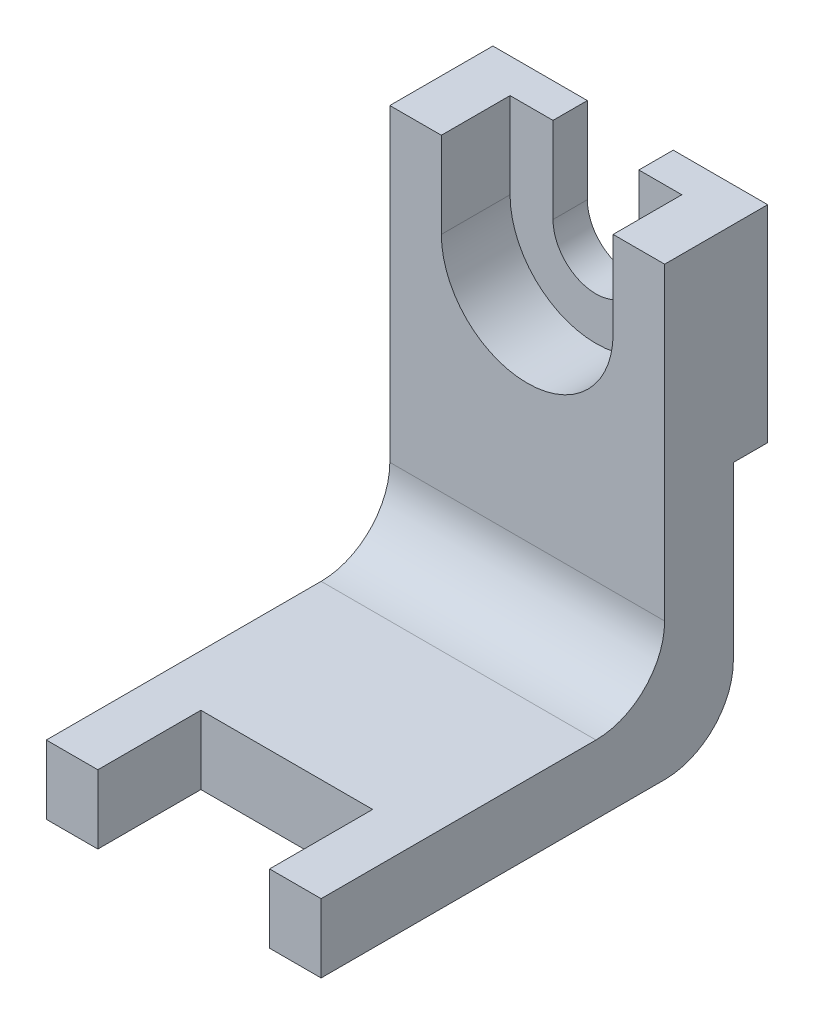
ISO-10303-21;
HEADER;
FILE_DESCRIPTION(('STEP AP214'),'2;1');
FILE_NAME('part.step','',(''),(''),'','','');
FILE_SCHEMA(('AUTOMOTIVE_DESIGN { 1 0 10303 214 1 1 1 1 }'));
ENDSEC;
DATA;
#1=APPLICATION_CONTEXT('core data for automotive mechanical design processes');
#2=APPLICATION_PROTOCOL_DEFINITION('international standard','automotive_design',2000,#1);
#3=PRODUCT_CONTEXT('',#1,'mechanical');
#4=PRODUCT('Part','Part','',(#3));
#5=PRODUCT_RELATED_PRODUCT_CATEGORY('part','',(#4));
#6=PRODUCT_DEFINITION_FORMATION('','',#4);
#7=PRODUCT_DEFINITION_CONTEXT('part definition',#1,'design');
#8=PRODUCT_DEFINITION('design','',#6,#7);
#9=PRODUCT_DEFINITION_SHAPE('','',#8);
#10=(LENGTH_UNIT() NAMED_UNIT(*) SI_UNIT(.MILLI.,.METRE.));
#11=(NAMED_UNIT(*) PLANE_ANGLE_UNIT() SI_UNIT($,.RADIAN.));
#12=(NAMED_UNIT(*) SI_UNIT($,.STERADIAN.) SOLID_ANGLE_UNIT());
#13=UNCERTAINTY_MEASURE_WITH_UNIT(LENGTH_MEASURE(1.E-05),#10,'distance_accuracy_value','');
#14=(GEOMETRIC_REPRESENTATION_CONTEXT(3) GLOBAL_UNCERTAINTY_ASSIGNED_CONTEXT((#13)) GLOBAL_UNIT_ASSIGNED_CONTEXT((#10,
#11,#12)) REPRESENTATION_CONTEXT('',''));
#15=CARTESIAN_POINT('',(0.,0.,0.));
#16=DIRECTION('',(0.,0.,1.));
#17=DIRECTION('',(1.,0.,0.));
#18=AXIS2_PLACEMENT_3D('',#15,#16,#17);
#19=CARTESIAN_POINT('',(-8.,13.,4.));
#20=DIRECTION('',(0.,-1.,0.));
#21=DIRECTION('',(0.,0.,-1.));
#22=AXIS2_PLACEMENT_3D('',#19,#20,#21);
#23=PLANE('',#22);
#24=DIRECTION('',(1.,0.,0.));
#25=VECTOR('',#24,1.);
#26=CARTESIAN_POINT('',(8.,13.,-2.));
#27=LINE('',#26,#25);
#28=CARTESIAN_POINT('',(2.5,13.,-2.));
#29=VERTEX_POINT('',#28);
#30=CARTESIAN_POINT('',(8.,13.,-2.));
#31=VERTEX_POINT('',#30);
#32=EDGE_CURVE('E251',#29,#31,#27,.T.);
#33=ORIENTED_EDGE('',*,*,#32,.F.);
#34=DIRECTION('',(0.,0.,1.));
#35=VECTOR('',#34,1.);
#36=CARTESIAN_POINT('',(2.5,13.,-2.));
#37=LINE('',#36,#35);
#38=CARTESIAN_POINT('',(2.5,13.,0.));
#39=VERTEX_POINT('',#38);
#40=EDGE_CURVE('E478',#29,#39,#37,.T.);
#41=ORIENTED_EDGE('',*,*,#40,.T.);
#42=DIRECTION('',(-1.,0.,0.));
#43=VECTOR('',#42,1.);
#44=CARTESIAN_POINT('',(-5.,13.,0.));
#45=LINE('',#44,#43);
#46=CARTESIAN_POINT('',(5.,13.,0.));
#47=VERTEX_POINT('',#46);
#48=EDGE_CURVE('E485',#47,#39,#45,.T.);
#49=ORIENTED_EDGE('',*,*,#48,.F.);
#50=DIRECTION('',(0.,0.,1.));
#51=VECTOR('',#50,1.);
#52=CARTESIAN_POINT('',(5.,13.,0.));
#53=LINE('',#52,#51);
#54=CARTESIAN_POINT('',(5.,13.,4.));
#55=VERTEX_POINT('',#54);
#56=EDGE_CURVE('E369',#47,#55,#53,.T.);
#57=ORIENTED_EDGE('',*,*,#56,.T.);
#58=DIRECTION('',(-1.,0.,0.));
#59=VECTOR('',#58,1.);
#60=CARTESIAN_POINT('',(-8.,13.,4.));
#61=LINE('',#60,#59);
#62=CARTESIAN_POINT('',(8.,13.,4.));
#63=VERTEX_POINT('',#62);
#64=EDGE_CURVE('E300',#63,#55,#61,.T.);
#65=ORIENTED_EDGE('',*,*,#64,.F.);
#66=DIRECTION('',(0.,0.,-1.));
#67=VECTOR('',#66,1.);
#68=CARTESIAN_POINT('',(8.,13.,4.));
#69=LINE('',#68,#67);
#70=EDGE_CURVE('E317',#63,#31,#69,.T.);
#71=ORIENTED_EDGE('',*,*,#70,.T.);
#72=EDGE_LOOP('',(#33,#41,#49,#57,#65,#71));
#73=FACE_BOUND('',#72,.T.);
#74=ADVANCED_FACE('F48',(#73),#23,.F.);
#75=CARTESIAN_POINT('',(0.,0.,24.));
#76=DIRECTION('',(0.,0.,-1.));
#77=DIRECTION('',(-1.,0.,0.));
#78=AXIS2_PLACEMENT_3D('',#75,#76,#77);
#79=PLANE('',#78);
#80=DIRECTION('',(-1.,0.,0.));
#81=VECTOR('',#80,1.);
#82=CARTESIAN_POINT('',(-8.,-8.99177735610371,24.));
#83=LINE('',#82,#81);
#84=CARTESIAN_POINT('',(8.,-8.99177735610371,24.));
#85=VERTEX_POINT('',#84);
#86=CARTESIAN_POINT('',(5.,-8.99177735610371,24.));
#87=VERTEX_POINT('',#86);
#88=EDGE_CURVE('E388',#85,#87,#83,.T.);
#89=ORIENTED_EDGE('',*,*,#88,.T.);
#90=DIRECTION('',(0.,1.,0.));
#91=VECTOR('',#90,1.);
#92=CARTESIAN_POINT('',(5.,-12.9917773561037,24.));
#93=LINE('',#92,#91);
#94=CARTESIAN_POINT('',(5.,-12.9917773561037,24.));
#95=VERTEX_POINT('',#94);
#96=EDGE_CURVE('E273',#95,#87,#93,.T.);
#97=ORIENTED_EDGE('',*,*,#96,.F.);
#98=DIRECTION('',(1.,0.,0.));
#99=VECTOR('',#98,1.);
#100=CARTESIAN_POINT('',(-8.,-12.9917773561037,24.));
#101=LINE('',#100,#99);
#102=CARTESIAN_POINT('',(8.,-12.9917773561037,24.));
#103=VERTEX_POINT('',#102);
#104=EDGE_CURVE('E408',#95,#103,#101,.T.);
#105=ORIENTED_EDGE('',*,*,#104,.T.);
#106=DIRECTION('',(0.,1.,0.));
#107=VECTOR('',#106,1.);
#108=CARTESIAN_POINT('',(8.,-12.9917773561037,24.));
#109=LINE('',#108,#107);
#110=EDGE_CURVE('E284',#103,#85,#109,.T.);
#111=ORIENTED_EDGE('',*,*,#110,.T.);
#112=EDGE_LOOP('',(#89,#97,#105,#111));
#113=FACE_BOUND('',#112,.T.);
#114=ADVANCED_FACE('F514',(#113),#79,.F.);
#115=CARTESIAN_POINT('',(0.,-8.99177735610371,4.));
#116=DIRECTION('',(1.,0.,0.));
#117=DIRECTION('',(0.,0.,-1.));
#118=AXIS2_PLACEMENT_3D('',#115,#116,#117);
#119=CYLINDRICAL_SURFACE('',#118,4.);
#120=DIRECTION('',(-1.,0.,0.));
#121=VECTOR('',#120,1.);
#122=CARTESIAN_POINT('',(0.,-8.99177735610371,0.));
#123=LINE('',#122,#121);
#124=CARTESIAN_POINT('',(8.,-8.99177735610371,0.));
#125=VERTEX_POINT('',#124);
#126=CARTESIAN_POINT('',(-8.,-8.99177735610372,0.));
#127=VERTEX_POINT('',#126);
#128=EDGE_CURVE('E335',#125,#127,#123,.T.);
#129=ORIENTED_EDGE('',*,*,#128,.F.);
#130=CARTESIAN_POINT('',(8.,-8.99177735610371,4.));
#131=DIRECTION('',(-1.,0.,0.));
#132=DIRECTION('',(0.,0.,1.));
#133=AXIS2_PLACEMENT_3D('',#130,#131,#132);
#134=CIRCLE('',#133,4.);
#135=CARTESIAN_POINT('',(8.,-12.9917773561037,4.));
#136=VERTEX_POINT('',#135);
#137=EDGE_CURVE('E57',#136,#125,#134,.F.);
#138=ORIENTED_EDGE('',*,*,#137,.F.);
#139=DIRECTION('',(1.,0.,0.));
#140=VECTOR('',#139,1.);
#141=CARTESIAN_POINT('',(-8.,-12.9917773561037,4.));
#142=LINE('',#141,#140);
#143=CARTESIAN_POINT('',(-8.,-12.9917773561037,4.));
#144=VERTEX_POINT('',#143);
#145=EDGE_CURVE('E283',#144,#136,#142,.T.);
#146=ORIENTED_EDGE('',*,*,#145,.F.);
#147=CARTESIAN_POINT('',(-8.,-8.99177735610371,4.));
#148=DIRECTION('',(1.,0.,0.));
#149=DIRECTION('',(0.,0.,-1.));
#150=AXIS2_PLACEMENT_3D('',#147,#148,#149);
#151=CIRCLE('',#150,4.);
#152=EDGE_CURVE('E12',#127,#144,#151,.F.);
#153=ORIENTED_EDGE('',*,*,#152,.F.);
#154=EDGE_LOOP('',(#129,#138,#146,#153));
#155=FACE_BOUND('',#154,.T.);
#156=ADVANCED_FACE('F50',(#155),#119,.T.);
#157=CARTESIAN_POINT('',(0.,-4.99177735610371,8.));
#158=DIRECTION('',(-1.,0.,0.));
#159=DIRECTION('',(0.,0.,1.));
#160=AXIS2_PLACEMENT_3D('',#157,#158,#159);
#161=CYLINDRICAL_SURFACE('',#160,4.);
#162=DIRECTION('',(1.,0.,0.));
#163=VECTOR('',#162,1.);
#164=CARTESIAN_POINT('',(0.,-4.99177735610371,4.));
#165=LINE('',#164,#163);
#166=CARTESIAN_POINT('',(-8.,-4.99177735610371,4.));
#167=VERTEX_POINT('',#166);
#168=CARTESIAN_POINT('',(8.,-4.99177735610371,4.));
#169=VERTEX_POINT('',#168);
#170=EDGE_CURVE('E321',#167,#169,#165,.T.);
#171=ORIENTED_EDGE('',*,*,#170,.F.);
#172=CARTESIAN_POINT('',(-8.,-4.99177735610371,8.));
#173=DIRECTION('',(1.,0.,0.));
#174=DIRECTION('',(0.,0.,-1.));
#175=AXIS2_PLACEMENT_3D('',#172,#173,#174);
#176=CIRCLE('',#175,4.);
#177=CARTESIAN_POINT('',(-8.,-8.99177735610371,8.));
#178=VERTEX_POINT('',#177);
#179=EDGE_CURVE('E329',#167,#178,#176,.F.);
#180=ORIENTED_EDGE('',*,*,#179,.T.);
#181=DIRECTION('',(1.,0.,0.));
#182=VECTOR('',#181,1.);
#183=CARTESIAN_POINT('',(0.,-8.99177735610371,8.));
#184=LINE('',#183,#182);
#185=CARTESIAN_POINT('',(8.,-8.99177735610371,8.));
#186=VERTEX_POINT('',#185);
#187=EDGE_CURVE('E325',#186,#178,#184,.F.);
#188=ORIENTED_EDGE('',*,*,#187,.F.);
#189=CARTESIAN_POINT('',(8.,-4.99177735610371,8.));
#190=DIRECTION('',(-1.,0.,0.));
#191=DIRECTION('',(0.,0.,1.));
#192=AXIS2_PLACEMENT_3D('',#189,#190,#191);
#193=CIRCLE('',#192,4.);
#194=EDGE_CURVE('E332',#186,#169,#193,.F.);
#195=ORIENTED_EDGE('',*,*,#194,.T.);
#196=EDGE_LOOP('',(#171,#180,#188,#195));
#197=FACE_BOUND('',#196,.T.);
#198=ADVANCED_FACE('F380',(#197),#161,.F.);
#199=CARTESIAN_POINT('',(0.,0.,4.));
#200=DIRECTION('',(0.,0.,-1.));
#201=DIRECTION('',(-1.,0.,0.));
#202=AXIS2_PLACEMENT_3D('',#199,#200,#201);
#203=PLANE('',#202);
#204=ORIENTED_EDGE('',*,*,#64,.T.);
#205=DIRECTION('',(0.,1.,0.));
#206=VECTOR('',#205,1.);
#207=CARTESIAN_POINT('',(5.,13.,4.));
#208=LINE('',#207,#206);
#209=CARTESIAN_POINT('',(5.,8.,4.));
#210=VERTEX_POINT('',#209);
#211=EDGE_CURVE('E374',#210,#55,#208,.T.);
#212=ORIENTED_EDGE('',*,*,#211,.F.);
#213=CARTESIAN_POINT('',(0.,8.,4.));
#214=DIRECTION('',(0.,0.,1.));
#215=DIRECTION('',(1.,0.,0.));
#216=AXIS2_PLACEMENT_3D('',#213,#214,#215);
#217=CIRCLE('',#216,5.);
#218=CARTESIAN_POINT('',(-5.,8.,4.));
#219=VERTEX_POINT('',#218);
#220=EDGE_CURVE('E477',#219,#210,#217,.T.);
#221=ORIENTED_EDGE('',*,*,#220,.F.);
#222=DIRECTION('',(0.,-1.,0.));
#223=VECTOR('',#222,1.);
#224=CARTESIAN_POINT('',(-5.,13.,4.));
#225=LINE('',#224,#223);
#226=CARTESIAN_POINT('',(-5.,13.,4.));
#227=VERTEX_POINT('',#226);
#228=EDGE_CURVE('E475',#227,#219,#225,.T.);
#229=ORIENTED_EDGE('',*,*,#228,.F.);
#230=CARTESIAN_POINT('',(-8.,13.,4.));
#231=VERTEX_POINT('',#230);
#232=EDGE_CURVE('E296',#227,#231,#61,.T.);
#233=ORIENTED_EDGE('',*,*,#232,.T.);
#234=DIRECTION('',(0.,-1.,0.));
#235=VECTOR('',#234,1.);
#236=CARTESIAN_POINT('',(-8.,-13.,4.));
#237=LINE('',#236,#235);
#238=EDGE_CURVE('E304',#231,#167,#237,.T.);
#239=ORIENTED_EDGE('',*,*,#238,.T.);
#240=ORIENTED_EDGE('',*,*,#170,.T.);
#241=DIRECTION('',(0.,1.,0.));
#242=VECTOR('',#241,1.);
#243=CARTESIAN_POINT('',(8.,-13.,4.));
#244=LINE('',#243,#242);
#245=EDGE_CURVE('E291',#169,#63,#244,.T.);
#246=ORIENTED_EDGE('',*,*,#245,.T.);
#247=EDGE_LOOP('',(#204,#212,#221,#229,#233,#239,#240,#246));
#248=FACE_BOUND('',#247,.T.);
#249=ADVANCED_FACE('F372',(#248),#203,.F.);
#250=CARTESIAN_POINT('',(8.,-13.,4.));
#251=DIRECTION('',(-1.,0.,0.));
#252=DIRECTION('',(0.,0.,1.));
#253=AXIS2_PLACEMENT_3D('',#250,#251,#252);
#254=PLANE('',#253);
#255=DIRECTION('',(0.,0.,-1.));
#256=VECTOR('',#255,1.);
#257=CARTESIAN_POINT('',(8.,-12.9917773561037,24.));
#258=LINE('',#257,#256);
#259=EDGE_CURVE('E348',#103,#136,#258,.T.);
#260=ORIENTED_EDGE('',*,*,#259,.T.);
#261=ORIENTED_EDGE('',*,*,#137,.T.);
#262=DIRECTION('',(0.,1.,0.));
#263=VECTOR('',#262,1.);
#264=CARTESIAN_POINT('',(8.,-13.,0.));
#265=LINE('',#264,#263);
#266=CARTESIAN_POINT('',(8.,1.,0.));
#267=VERTEX_POINT('',#266);
#268=EDGE_CURVE('E308',#125,#267,#265,.T.);
#269=ORIENTED_EDGE('',*,*,#268,.T.);
#270=DIRECTION('',(0.,0.,1.));
#271=VECTOR('',#270,1.);
#272=CARTESIAN_POINT('',(8.,1.,-2.));
#273=LINE('',#272,#271);
#274=CARTESIAN_POINT('',(8.,1.,-2.));
#275=VERTEX_POINT('',#274);
#276=EDGE_CURVE('E278',#275,#267,#273,.T.);
#277=ORIENTED_EDGE('',*,*,#276,.F.);
#278=DIRECTION('',(0.,-1.,0.));
#279=VECTOR('',#278,1.);
#280=CARTESIAN_POINT('',(8.,1.,-2.));
#281=LINE('',#280,#279);
#282=EDGE_CURVE('E250',#31,#275,#281,.T.);
#283=ORIENTED_EDGE('',*,*,#282,.F.);
#284=ORIENTED_EDGE('',*,*,#70,.F.);
#285=ORIENTED_EDGE('',*,*,#245,.F.);
#286=ORIENTED_EDGE('',*,*,#194,.F.);
#287=DIRECTION('',(0.,0.,-1.));
#288=VECTOR('',#287,1.);
#289=CARTESIAN_POINT('',(8.,-8.99177735610371,24.));
#290=LINE('',#289,#288);
#291=EDGE_CURVE('E298',#85,#186,#290,.T.);
#292=ORIENTED_EDGE('',*,*,#291,.F.);
#293=ORIENTED_EDGE('',*,*,#110,.F.);
#294=EDGE_LOOP('',(#260,#261,#269,#277,#283,#284,#285,#286,#292,#293));
#295=FACE_BOUND('',#294,.T.);
#296=ADVANCED_FACE('F342',(#295),#254,.F.);
#297=CARTESIAN_POINT('',(-2.5,13.,0.));
#298=VERTEX_POINT('',#297);
#299=CARTESIAN_POINT('',(-5.,13.,0.));
#300=VERTEX_POINT('',#299);
#301=EDGE_CURVE('E242',#298,#300,#45,.T.);
#302=ORIENTED_EDGE('',*,*,#301,.F.);
#303=DIRECTION('',(0.,0.,1.));
#304=VECTOR('',#303,1.);
#305=CARTESIAN_POINT('',(-2.5,13.,-2.));
#306=LINE('',#305,#304);
#307=CARTESIAN_POINT('',(-2.5,13.,-2.));
#308=VERTEX_POINT('',#307);
#309=EDGE_CURVE('E64',#308,#298,#306,.T.);
#310=ORIENTED_EDGE('',*,*,#309,.F.);
#311=CARTESIAN_POINT('',(-8.,13.,-2.));
#312=VERTEX_POINT('',#311);
#313=EDGE_CURVE('E239',#312,#308,#27,.T.);
#314=ORIENTED_EDGE('',*,*,#313,.F.);
#315=DIRECTION('',(0.,0.,-1.));
#316=VECTOR('',#315,1.);
#317=CARTESIAN_POINT('',(-8.,13.,4.));
#318=LINE('',#317,#316);
#319=EDGE_CURVE('E307',#231,#312,#318,.T.);
#320=ORIENTED_EDGE('',*,*,#319,.F.);
#321=ORIENTED_EDGE('',*,*,#232,.F.);
#322=DIRECTION('',(0.,0.,1.));
#323=VECTOR('',#322,1.);
#324=CARTESIAN_POINT('',(-5.,13.,0.));
#325=LINE('',#324,#323);
#326=EDGE_CURVE('E461',#300,#227,#325,.T.);
#327=ORIENTED_EDGE('',*,*,#326,.F.);
#328=EDGE_LOOP('',(#302,#310,#314,#320,#321,#327));
#329=FACE_BOUND('',#328,.T.);
#330=ADVANCED_FACE('F237',(#329),#23,.F.);
#331=CARTESIAN_POINT('',(-8.,-13.,4.));
#332=DIRECTION('',(1.,0.,0.));
#333=DIRECTION('',(0.,0.,-1.));
#334=AXIS2_PLACEMENT_3D('',#331,#332,#333);
#335=PLANE('',#334);
#336=DIRECTION('',(0.,-1.,0.));
#337=VECTOR('',#336,1.);
#338=CARTESIAN_POINT('',(-8.,-13.,0.));
#339=LINE('',#338,#337);
#340=CARTESIAN_POINT('',(-8.,1.,0.));
#341=VERTEX_POINT('',#340);
#342=EDGE_CURVE('E297',#341,#127,#339,.T.);
#343=ORIENTED_EDGE('',*,*,#342,.T.);
#344=ORIENTED_EDGE('',*,*,#152,.T.);
#345=DIRECTION('',(0.,0.,-1.));
#346=VECTOR('',#345,1.);
#347=CARTESIAN_POINT('',(-8.,-12.9917773561037,24.));
#348=LINE('',#347,#346);
#349=CARTESIAN_POINT('',(-8.,-12.9917773561037,24.));
#350=VERTEX_POINT('',#349);
#351=EDGE_CURVE('E393',#350,#144,#348,.T.);
#352=ORIENTED_EDGE('',*,*,#351,.F.);
#353=DIRECTION('',(0.,-1.,0.));
#354=VECTOR('',#353,1.);
#355=CARTESIAN_POINT('',(-8.,-12.9917773561037,24.));
#356=LINE('',#355,#354);
#357=CARTESIAN_POINT('',(-8.,-8.99177735610371,24.));
#358=VERTEX_POINT('',#357);
#359=EDGE_CURVE('E409',#358,#350,#356,.T.);
#360=ORIENTED_EDGE('',*,*,#359,.F.);
#361=DIRECTION('',(0.,0.,-1.));
#362=VECTOR('',#361,1.);
#363=CARTESIAN_POINT('',(-8.,-8.99177735610371,24.));
#364=LINE('',#363,#362);
#365=EDGE_CURVE('E391',#358,#178,#364,.T.);
#366=ORIENTED_EDGE('',*,*,#365,.T.);
#367=ORIENTED_EDGE('',*,*,#179,.F.);
#368=ORIENTED_EDGE('',*,*,#238,.F.);
#369=ORIENTED_EDGE('',*,*,#319,.T.);
#370=DIRECTION('',(0.,1.,0.));
#371=VECTOR('',#370,1.);
#372=CARTESIAN_POINT('',(-8.,1.,-2.));
#373=LINE('',#372,#371);
#374=CARTESIAN_POINT('',(-8.,1.,-2.));
#375=VERTEX_POINT('',#374);
#376=EDGE_CURVE('E248',#375,#312,#373,.T.);
#377=ORIENTED_EDGE('',*,*,#376,.F.);
#378=DIRECTION('',(0.,0.,1.));
#379=VECTOR('',#378,1.);
#380=CARTESIAN_POINT('',(-8.,1.,-2.));
#381=LINE('',#380,#379);
#382=EDGE_CURVE('E274',#375,#341,#381,.T.);
#383=ORIENTED_EDGE('',*,*,#382,.T.);
#384=EDGE_LOOP('',(#343,#344,#352,#360,#366,#367,#368,#369,#377,#383));
#385=FACE_BOUND('',#384,.T.);
#386=ADVANCED_FACE('F498',(#385),#335,.F.);
#387=CARTESIAN_POINT('',(0.,0.,0.));
#388=DIRECTION('',(0.,0.,-1.));
#389=DIRECTION('',(-1.,0.,0.));
#390=AXIS2_PLACEMENT_3D('',#387,#388,#389);
#391=PLANE('',#390);
#392=ORIENTED_EDGE('',*,*,#268,.F.);
#393=ORIENTED_EDGE('',*,*,#128,.T.);
#394=ORIENTED_EDGE('',*,*,#342,.F.);
#395=DIRECTION('',(-1.,0.,0.));
#396=VECTOR('',#395,1.);
#397=CARTESIAN_POINT('',(8.,1.,0.));
#398=LINE('',#397,#396);
#399=EDGE_CURVE('E268',#267,#341,#398,.T.);
#400=ORIENTED_EDGE('',*,*,#399,.F.);
#401=EDGE_LOOP('',(#392,#393,#394,#400));
#402=FACE_BOUND('',#401,.T.);
#403=ADVANCED_FACE('F353',(#402),#391,.T.);
#404=CARTESIAN_POINT('',(-8.,-8.99177735610371,24.));
#405=DIRECTION('',(0.,-1.,0.));
#406=DIRECTION('',(0.,0.,-1.));
#407=AXIS2_PLACEMENT_3D('',#404,#405,#406);
#408=PLANE('',#407);
#409=DIRECTION('',(-1.,0.,0.));
#410=VECTOR('',#409,1.);
#411=CARTESIAN_POINT('',(-5.,-8.99177735610371,18.));
#412=LINE('',#411,#410);
#413=CARTESIAN_POINT('',(5.,-8.99177735610371,18.));
#414=VERTEX_POINT('',#413);
#415=CARTESIAN_POINT('',(-5.,-8.99177735610371,18.));
#416=VERTEX_POINT('',#415);
#417=EDGE_CURVE('E424',#414,#416,#412,.T.);
#418=ORIENTED_EDGE('',*,*,#417,.F.);
#419=DIRECTION('',(0.,0.,-1.));
#420=VECTOR('',#419,1.);
#421=CARTESIAN_POINT('',(5.,-8.99177735610371,24.));
#422=LINE('',#421,#420);
#423=EDGE_CURVE('E445',#87,#414,#422,.T.);
#424=ORIENTED_EDGE('',*,*,#423,.F.);
#425=ORIENTED_EDGE('',*,*,#88,.F.);
#426=ORIENTED_EDGE('',*,*,#291,.T.);
#427=ORIENTED_EDGE('',*,*,#187,.T.);
#428=ORIENTED_EDGE('',*,*,#365,.F.);
#429=CARTESIAN_POINT('',(-5.,-8.99177735610371,24.));
#430=VERTEX_POINT('',#429);
#431=EDGE_CURVE('E516',#430,#358,#83,.T.);
#432=ORIENTED_EDGE('',*,*,#431,.F.);
#433=DIRECTION('',(0.,0.,1.));
#434=VECTOR('',#433,1.);
#435=CARTESIAN_POINT('',(-5.,-8.99177735610371,24.));
#436=LINE('',#435,#434);
#437=EDGE_CURVE('E418',#416,#430,#436,.T.);
#438=ORIENTED_EDGE('',*,*,#437,.F.);
#439=EDGE_LOOP('',(#418,#424,#425,#426,#427,#428,#432,#438));
#440=FACE_BOUND('',#439,.T.);
#441=ADVANCED_FACE('F385',(#440),#408,.F.);
#442=CARTESIAN_POINT('',(-8.,-12.9917773561037,24.));
#443=DIRECTION('',(0.,1.,0.));
#444=DIRECTION('',(0.,0.,1.));
#445=AXIS2_PLACEMENT_3D('',#442,#443,#444);
#446=PLANE('',#445);
#447=ORIENTED_EDGE('',*,*,#104,.F.);
#448=DIRECTION('',(0.,0.,-1.));
#449=VECTOR('',#448,1.);
#450=CARTESIAN_POINT('',(5.,-12.9917773561037,24.));
#451=LINE('',#450,#449);
#452=CARTESIAN_POINT('',(5.,-12.9917773561037,18.));
#453=VERTEX_POINT('',#452);
#454=EDGE_CURVE('E423',#95,#453,#451,.T.);
#455=ORIENTED_EDGE('',*,*,#454,.T.);
#456=DIRECTION('',(-1.,0.,0.));
#457=VECTOR('',#456,1.);
#458=CARTESIAN_POINT('',(-5.,-12.9917773561037,18.));
#459=LINE('',#458,#457);
#460=CARTESIAN_POINT('',(-5.,-12.9917773561037,18.));
#461=VERTEX_POINT('',#460);
#462=EDGE_CURVE('E434',#453,#461,#459,.T.);
#463=ORIENTED_EDGE('',*,*,#462,.T.);
#464=DIRECTION('',(0.,0.,1.));
#465=VECTOR('',#464,1.);
#466=CARTESIAN_POINT('',(-5.,-12.9917773561037,24.));
#467=LINE('',#466,#465);
#468=CARTESIAN_POINT('',(-5.,-12.9917773561037,24.));
#469=VERTEX_POINT('',#468);
#470=EDGE_CURVE('E439',#461,#469,#467,.T.);
#471=ORIENTED_EDGE('',*,*,#470,.T.);
#472=EDGE_CURVE('E402',#350,#469,#101,.T.);
#473=ORIENTED_EDGE('',*,*,#472,.F.);
#474=ORIENTED_EDGE('',*,*,#351,.T.);
#475=ORIENTED_EDGE('',*,*,#145,.T.);
#476=ORIENTED_EDGE('',*,*,#259,.F.);
#477=EDGE_LOOP('',(#447,#455,#463,#471,#473,#474,#475,#476));
#478=FACE_BOUND('',#477,.T.);
#479=ADVANCED_FACE('F509',(#478),#446,.F.);
#480=ORIENTED_EDGE('',*,*,#472,.T.);
#481=DIRECTION('',(0.,1.,0.));
#482=VECTOR('',#481,1.);
#483=CARTESIAN_POINT('',(-5.,-12.9917773561037,24.));
#484=LINE('',#483,#482);
#485=EDGE_CURVE('E428',#469,#430,#484,.T.);
#486=ORIENTED_EDGE('',*,*,#485,.T.);
#487=ORIENTED_EDGE('',*,*,#431,.T.);
#488=ORIENTED_EDGE('',*,*,#359,.T.);
#489=EDGE_LOOP('',(#480,#486,#487,#488));
#490=FACE_BOUND('',#489,.T.);
#491=ADVANCED_FACE('F522',(#490),#79,.F.);
#492=CARTESIAN_POINT('',(8.,1.,-2.));
#493=DIRECTION('',(0.,1.,0.));
#494=DIRECTION('',(0.,0.,1.));
#495=AXIS2_PLACEMENT_3D('',#492,#493,#494);
#496=PLANE('',#495);
#497=ORIENTED_EDGE('',*,*,#399,.T.);
#498=ORIENTED_EDGE('',*,*,#382,.F.);
#499=DIRECTION('',(-1.,0.,0.));
#500=VECTOR('',#499,1.);
#501=CARTESIAN_POINT('',(8.,1.,-2.));
#502=LINE('',#501,#500);
#503=EDGE_CURVE('E255',#275,#375,#502,.T.);
#504=ORIENTED_EDGE('',*,*,#503,.F.);
#505=ORIENTED_EDGE('',*,*,#276,.T.);
#506=EDGE_LOOP('',(#497,#498,#504,#505));
#507=FACE_BOUND('',#506,.T.);
#508=ADVANCED_FACE('F357',(#507),#496,.F.);
#509=CARTESIAN_POINT('',(0.,0.,-2.));
#510=DIRECTION('',(0.,0.,1.));
#511=DIRECTION('',(1.,0.,0.));
#512=AXIS2_PLACEMENT_3D('',#509,#510,#511);
#513=PLANE('',#512);
#514=CARTESIAN_POINT('',(0.,8.,-2.));
#515=DIRECTION('',(0.,0.,1.));
#516=DIRECTION('',(1.,0.,0.));
#517=AXIS2_PLACEMENT_3D('',#514,#515,#516);
#518=CIRCLE('',#517,2.5);
#519=CARTESIAN_POINT('',(-2.5,8.,-2.));
#520=VERTEX_POINT('',#519);
#521=CARTESIAN_POINT('',(2.5,8.,-2.));
#522=VERTEX_POINT('',#521);
#523=EDGE_CURVE('E231',#520,#522,#518,.T.);
#524=ORIENTED_EDGE('',*,*,#523,.T.);
#525=DIRECTION('',(0.,1.,0.));
#526=VECTOR('',#525,1.);
#527=CARTESIAN_POINT('',(2.5,13.,-2.));
#528=LINE('',#527,#526);
#529=EDGE_CURVE('E244',#522,#29,#528,.T.);
#530=ORIENTED_EDGE('',*,*,#529,.T.);
#531=ORIENTED_EDGE('',*,*,#32,.T.);
#532=ORIENTED_EDGE('',*,*,#282,.T.);
#533=ORIENTED_EDGE('',*,*,#503,.T.);
#534=ORIENTED_EDGE('',*,*,#376,.T.);
#535=ORIENTED_EDGE('',*,*,#313,.T.);
#536=DIRECTION('',(0.,-1.,0.));
#537=VECTOR('',#536,1.);
#538=CARTESIAN_POINT('',(-2.5,13.,-2.));
#539=LINE('',#538,#537);
#540=EDGE_CURVE('E223',#308,#520,#539,.T.);
#541=ORIENTED_EDGE('',*,*,#540,.T.);
#542=EDGE_LOOP('',(#524,#530,#531,#532,#533,#534,#535,#541));
#543=FACE_BOUND('',#542,.T.);
#544=ADVANCED_FACE('F246',(#543),#513,.F.);
#545=CARTESIAN_POINT('',(5.,-12.9917773561037,24.));
#546=DIRECTION('',(1.,0.,0.));
#547=DIRECTION('',(0.,0.,-1.));
#548=AXIS2_PLACEMENT_3D('',#545,#546,#547);
#549=PLANE('',#548);
#550=ORIENTED_EDGE('',*,*,#423,.T.);
#551=DIRECTION('',(0.,1.,0.));
#552=VECTOR('',#551,1.);
#553=CARTESIAN_POINT('',(5.,-12.9917773561037,18.));
#554=LINE('',#553,#552);
#555=EDGE_CURVE('E444',#453,#414,#554,.T.);
#556=ORIENTED_EDGE('',*,*,#555,.F.);
#557=ORIENTED_EDGE('',*,*,#454,.F.);
#558=ORIENTED_EDGE('',*,*,#96,.T.);
#559=EDGE_LOOP('',(#550,#556,#557,#558));
#560=FACE_BOUND('',#559,.T.);
#561=ADVANCED_FACE('F512',(#560),#549,.F.);
#562=CARTESIAN_POINT('',(-5.,-12.9917773561037,24.));
#563=DIRECTION('',(-1.,0.,0.));
#564=DIRECTION('',(0.,0.,1.));
#565=AXIS2_PLACEMENT_3D('',#562,#563,#564);
#566=PLANE('',#565);
#567=ORIENTED_EDGE('',*,*,#437,.T.);
#568=ORIENTED_EDGE('',*,*,#485,.F.);
#569=ORIENTED_EDGE('',*,*,#470,.F.);
#570=DIRECTION('',(0.,1.,0.));
#571=VECTOR('',#570,1.);
#572=CARTESIAN_POINT('',(-5.,-12.9917773561037,18.));
#573=LINE('',#572,#571);
#574=EDGE_CURVE('E503',#461,#416,#573,.T.);
#575=ORIENTED_EDGE('',*,*,#574,.T.);
#576=EDGE_LOOP('',(#567,#568,#569,#575));
#577=FACE_BOUND('',#576,.T.);
#578=ADVANCED_FACE('F528',(#577),#566,.F.);
#579=CARTESIAN_POINT('',(-5.,-12.9917773561037,18.));
#580=DIRECTION('',(0.,0.,-1.));
#581=DIRECTION('',(-1.,0.,0.));
#582=AXIS2_PLACEMENT_3D('',#579,#580,#581);
#583=PLANE('',#582);
#584=ORIENTED_EDGE('',*,*,#417,.T.);
#585=ORIENTED_EDGE('',*,*,#574,.F.);
#586=ORIENTED_EDGE('',*,*,#462,.F.);
#587=ORIENTED_EDGE('',*,*,#555,.T.);
#588=EDGE_LOOP('',(#584,#585,#586,#587));
#589=FACE_BOUND('',#588,.T.);
#590=ADVANCED_FACE('F530',(#589),#583,.F.);
#591=CARTESIAN_POINT('',(5.,13.,0.));
#592=DIRECTION('',(1.,0.,0.));
#593=DIRECTION('',(0.,1.,0.));
#594=AXIS2_PLACEMENT_3D('',#591,#592,#593);
#595=PLANE('',#594);
#596=ORIENTED_EDGE('',*,*,#211,.T.);
#597=ORIENTED_EDGE('',*,*,#56,.F.);
#598=DIRECTION('',(0.,1.,0.));
#599=VECTOR('',#598,1.);
#600=CARTESIAN_POINT('',(5.,13.,0.));
#601=LINE('',#600,#599);
#602=CARTESIAN_POINT('',(5.,8.,0.));
#603=VERTEX_POINT('',#602);
#604=EDGE_CURVE('E72',#603,#47,#601,.T.);
#605=ORIENTED_EDGE('',*,*,#604,.F.);
#606=DIRECTION('',(0.,0.,1.));
#607=VECTOR('',#606,1.);
#608=CARTESIAN_POINT('',(5.,8.,0.));
#609=LINE('',#608,#607);
#610=EDGE_CURVE('E452',#603,#210,#609,.T.);
#611=ORIENTED_EDGE('',*,*,#610,.T.);
#612=EDGE_LOOP('',(#596,#597,#605,#611));
#613=FACE_BOUND('',#612,.T.);
#614=ADVANCED_FACE('F532',(#613),#595,.F.);
#615=CARTESIAN_POINT('',(0.,8.,0.));
#616=DIRECTION('',(0.,0.,1.));
#617=DIRECTION('',(1.,0.,0.));
#618=AXIS2_PLACEMENT_3D('',#615,#616,#617);
#619=CYLINDRICAL_SURFACE('',#618,5.);
#620=ORIENTED_EDGE('',*,*,#220,.T.);
#621=ORIENTED_EDGE('',*,*,#610,.F.);
#622=CARTESIAN_POINT('',(0.,8.,0.));
#623=DIRECTION('',(0.,0.,1.));
#624=DIRECTION('',(1.,0.,0.));
#625=AXIS2_PLACEMENT_3D('',#622,#623,#624);
#626=CIRCLE('',#625,5.);
#627=CARTESIAN_POINT('',(-5.,8.,0.));
#628=VERTEX_POINT('',#627);
#629=EDGE_CURVE('E468',#628,#603,#626,.T.);
#630=ORIENTED_EDGE('',*,*,#629,.F.);
#631=DIRECTION('',(0.,0.,1.));
#632=VECTOR('',#631,1.);
#633=CARTESIAN_POINT('',(-5.,8.,0.));
#634=LINE('',#633,#632);
#635=EDGE_CURVE('E455',#628,#219,#634,.T.);
#636=ORIENTED_EDGE('',*,*,#635,.T.);
#637=EDGE_LOOP('',(#620,#621,#630,#636));
#638=FACE_BOUND('',#637,.T.);
#639=ADVANCED_FACE('F538',(#638),#619,.F.);
#640=CARTESIAN_POINT('',(-5.,13.,0.));
#641=DIRECTION('',(-1.,0.,0.));
#642=DIRECTION('',(0.,0.,1.));
#643=AXIS2_PLACEMENT_3D('',#640,#641,#642);
#644=PLANE('',#643);
#645=ORIENTED_EDGE('',*,*,#228,.T.);
#646=ORIENTED_EDGE('',*,*,#635,.F.);
#647=DIRECTION('',(0.,-1.,0.));
#648=VECTOR('',#647,1.);
#649=CARTESIAN_POINT('',(-5.,13.,0.));
#650=LINE('',#649,#648);
#651=EDGE_CURVE('E471',#300,#628,#650,.T.);
#652=ORIENTED_EDGE('',*,*,#651,.F.);
#653=ORIENTED_EDGE('',*,*,#326,.T.);
#654=EDGE_LOOP('',(#645,#646,#652,#653));
#655=FACE_BOUND('',#654,.T.);
#656=ADVANCED_FACE('F494',(#655),#644,.F.);
#657=CARTESIAN_POINT('',(0.,8.,0.));
#658=DIRECTION('',(0.,0.,1.));
#659=DIRECTION('',(1.,0.,0.));
#660=AXIS2_PLACEMENT_3D('',#657,#658,#659);
#661=PLANE('',#660);
#662=DIRECTION('',(0.,1.,0.));
#663=VECTOR('',#662,1.);
#664=CARTESIAN_POINT('',(2.5,13.,0.));
#665=LINE('',#664,#663);
#666=CARTESIAN_POINT('',(2.5,8.,0.));
#667=VERTEX_POINT('',#666);
#668=EDGE_CURVE('E232',#667,#39,#665,.T.);
#669=ORIENTED_EDGE('',*,*,#668,.F.);
#670=CARTESIAN_POINT('',(0.,8.,0.));
#671=DIRECTION('',(0.,0.,1.));
#672=DIRECTION('',(1.,0.,0.));
#673=AXIS2_PLACEMENT_3D('',#670,#671,#672);
#674=CIRCLE('',#673,2.5);
#675=CARTESIAN_POINT('',(-2.5,8.,0.));
#676=VERTEX_POINT('',#675);
#677=EDGE_CURVE('E747',#676,#667,#674,.T.);
#678=ORIENTED_EDGE('',*,*,#677,.F.);
#679=DIRECTION('',(0.,-1.,0.));
#680=VECTOR('',#679,1.);
#681=CARTESIAN_POINT('',(-2.5,13.,0.));
#682=LINE('',#681,#680);
#683=EDGE_CURVE('E750',#298,#676,#682,.T.);
#684=ORIENTED_EDGE('',*,*,#683,.F.);
#685=ORIENTED_EDGE('',*,*,#301,.T.);
#686=ORIENTED_EDGE('',*,*,#651,.T.);
#687=ORIENTED_EDGE('',*,*,#629,.T.);
#688=ORIENTED_EDGE('',*,*,#604,.T.);
#689=ORIENTED_EDGE('',*,*,#48,.T.);
#690=EDGE_LOOP('',(#669,#678,#684,#685,#686,#687,#688,#689));
#691=FACE_BOUND('',#690,.T.);
#692=ADVANCED_FACE('F492',(#691),#661,.T.);
#693=CARTESIAN_POINT('',(2.5,13.,-2.));
#694=DIRECTION('',(1.,0.,0.));
#695=DIRECTION('',(0.,1.,0.));
#696=AXIS2_PLACEMENT_3D('',#693,#694,#695);
#697=PLANE('',#696);
#698=ORIENTED_EDGE('',*,*,#668,.T.);
#699=ORIENTED_EDGE('',*,*,#40,.F.);
#700=ORIENTED_EDGE('',*,*,#529,.F.);
#701=DIRECTION('',(0.,0.,1.));
#702=VECTOR('',#701,1.);
#703=CARTESIAN_POINT('',(2.5,8.,-2.));
#704=LINE('',#703,#702);
#705=EDGE_CURVE('E748',#522,#667,#704,.T.);
#706=ORIENTED_EDGE('',*,*,#705,.T.);
#707=EDGE_LOOP('',(#698,#699,#700,#706));
#708=FACE_BOUND('',#707,.T.);
#709=ADVANCED_FACE('F713',(#708),#697,.F.);
#710=CARTESIAN_POINT('',(0.,8.,-2.));
#711=DIRECTION('',(0.,0.,1.));
#712=DIRECTION('',(1.,0.,0.));
#713=AXIS2_PLACEMENT_3D('',#710,#711,#712);
#714=CYLINDRICAL_SURFACE('',#713,2.5);
#715=ORIENTED_EDGE('',*,*,#677,.T.);
#716=ORIENTED_EDGE('',*,*,#705,.F.);
#717=ORIENTED_EDGE('',*,*,#523,.F.);
#718=DIRECTION('',(0.,0.,1.));
#719=VECTOR('',#718,1.);
#720=CARTESIAN_POINT('',(-2.5,8.,-2.));
#721=LINE('',#720,#719);
#722=EDGE_CURVE('E225',#520,#676,#721,.T.);
#723=ORIENTED_EDGE('',*,*,#722,.T.);
#724=EDGE_LOOP('',(#715,#716,#717,#723));
#725=FACE_BOUND('',#724,.T.);
#726=ADVANCED_FACE('F719',(#725),#714,.F.);
#727=CARTESIAN_POINT('',(-2.5,13.,-2.));
#728=DIRECTION('',(-1.,0.,0.));
#729=DIRECTION('',(0.,-1.,0.));
#730=AXIS2_PLACEMENT_3D('',#727,#728,#729);
#731=PLANE('',#730);
#732=ORIENTED_EDGE('',*,*,#683,.T.);
#733=ORIENTED_EDGE('',*,*,#722,.F.);
#734=ORIENTED_EDGE('',*,*,#540,.F.);
#735=ORIENTED_EDGE('',*,*,#309,.T.);
#736=EDGE_LOOP('',(#732,#733,#734,#735));
#737=FACE_BOUND('',#736,.T.);
#738=ADVANCED_FACE('F224',(#737),#731,.F.);
#739=CLOSED_SHELL('',(#74,#114,#156,#198,#249,#296,#330,#386,#403,#441,#479,#491,#508,#544,#561,
#578,#590,#614,#639,#656,#692,#709,#726,#738));
#740=MANIFOLD_SOLID_BREP('B2',#739);
#741=ADVANCED_BREP_SHAPE_REPRESENTATION('',(#18,#740),#14);
#742=SHAPE_DEFINITION_REPRESENTATION(#9,#741);
ENDSEC;
END-ISO-10303-21;
